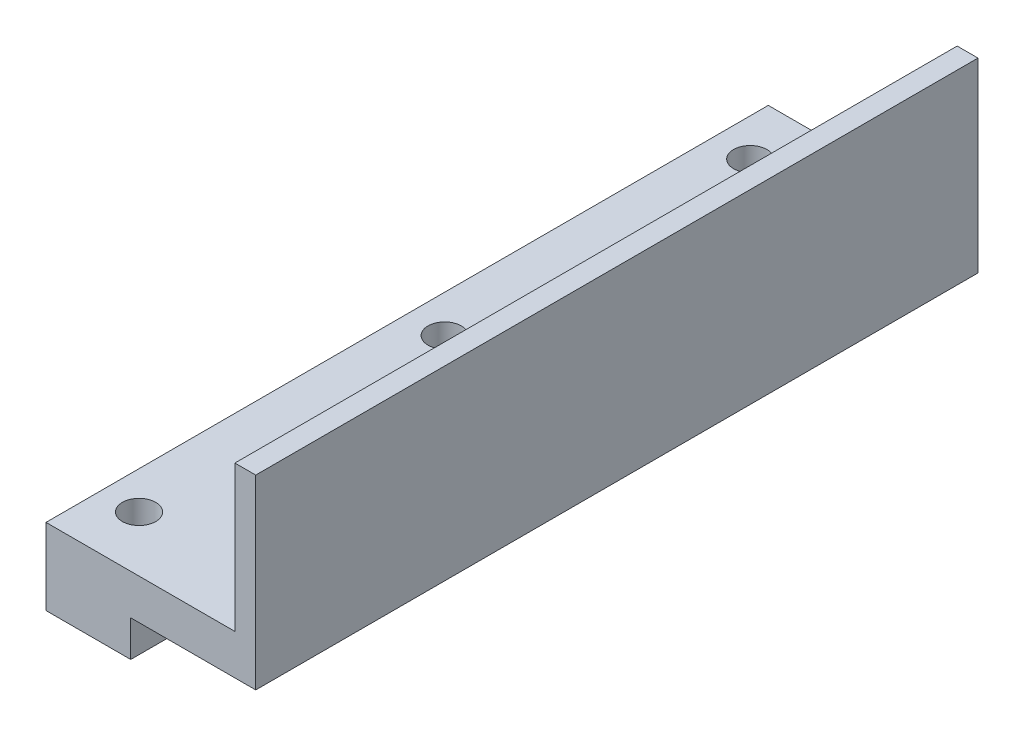
ISO-10303-21;
HEADER;
FILE_DESCRIPTION(('STEP AP214'),'2;1');
FILE_NAME('part.step','',(''),(''),'','','');
FILE_SCHEMA(('AUTOMOTIVE_DESIGN { 1 0 10303 214 1 1 1 1 }'));
ENDSEC;
DATA;
#1=APPLICATION_CONTEXT('core data for automotive mechanical design processes');
#2=APPLICATION_PROTOCOL_DEFINITION('international standard','automotive_design',2000,#1);
#3=PRODUCT_CONTEXT('',#1,'mechanical');
#4=PRODUCT('Part','Part','',(#3));
#5=PRODUCT_RELATED_PRODUCT_CATEGORY('part','',(#4));
#6=PRODUCT_DEFINITION_FORMATION('','',#4);
#7=PRODUCT_DEFINITION_CONTEXT('part definition',#1,'design');
#8=PRODUCT_DEFINITION('design','',#6,#7);
#9=PRODUCT_DEFINITION_SHAPE('','',#8);
#10=(LENGTH_UNIT() NAMED_UNIT(*) SI_UNIT(.MILLI.,.METRE.));
#11=(NAMED_UNIT(*) PLANE_ANGLE_UNIT() SI_UNIT($,.RADIAN.));
#12=(NAMED_UNIT(*) SI_UNIT($,.STERADIAN.) SOLID_ANGLE_UNIT());
#13=UNCERTAINTY_MEASURE_WITH_UNIT(LENGTH_MEASURE(1.E-05),#10,'distance_accuracy_value','');
#14=(GEOMETRIC_REPRESENTATION_CONTEXT(3) GLOBAL_UNCERTAINTY_ASSIGNED_CONTEXT((#13)) GLOBAL_UNIT_ASSIGNED_CONTEXT((#10,
#11,#12)) REPRESENTATION_CONTEXT('',''));
#15=CARTESIAN_POINT('',(0.,0.,0.));
#16=DIRECTION('',(0.,0.,1.));
#17=DIRECTION('',(1.,0.,0.));
#18=AXIS2_PLACEMENT_3D('',#15,#16,#17);
#19=CARTESIAN_POINT('',(13.6,5.5,26.));
#20=DIRECTION('',(0.,-1.,0.));
#21=DIRECTION('',(1.,0.,0.));
#22=AXIS2_PLACEMENT_3D('',#19,#20,#21);
#23=PLANE('',#22);
#24=CARTESIAN_POINT('',(2.7,5.5,-22.));
#25=DIRECTION('',(0.,1.,0.));
#26=DIRECTION('',(0.,0.,1.));
#27=AXIS2_PLACEMENT_3D('',#24,#25,#26);
#28=CIRCLE('',#27,1.2);
#29=CARTESIAN_POINT('',(2.7,5.5,-20.8));
#30=VERTEX_POINT('',#29);
#31=EDGE_CURVE('E143',#30,#30,#28,.T.);
#32=ORIENTED_EDGE('',*,*,#31,.F.);
#33=EDGE_LOOP('',(#32));
#34=FACE_BOUND('',#33,.T.);
#35=CARTESIAN_POINT('',(2.7,5.5,0.));
#36=DIRECTION('',(0.,1.,0.));
#37=DIRECTION('',(0.,0.,1.));
#38=AXIS2_PLACEMENT_3D('',#35,#36,#37);
#39=CIRCLE('',#38,1.2);
#40=CARTESIAN_POINT('',(2.7,5.5,1.2));
#41=VERTEX_POINT('',#40);
#42=EDGE_CURVE('E138',#41,#41,#39,.T.);
#43=ORIENTED_EDGE('',*,*,#42,.F.);
#44=EDGE_LOOP('',(#43));
#45=FACE_BOUND('',#44,.T.);
#46=CARTESIAN_POINT('',(2.7,5.5,22.));
#47=DIRECTION('',(0.,1.,0.));
#48=DIRECTION('',(0.,0.,-1.));
#49=AXIS2_PLACEMENT_3D('',#46,#47,#48);
#50=CIRCLE('',#49,1.2);
#51=CARTESIAN_POINT('',(2.7,5.5,23.2));
#52=VERTEX_POINT('',#51);
#53=EDGE_CURVE('E135',#52,#52,#50,.T.);
#54=ORIENTED_EDGE('',*,*,#53,.F.);
#55=EDGE_LOOP('',(#54));
#56=FACE_BOUND('',#55,.T.);
#57=DIRECTION('',(-1.,0.,0.));
#58=VECTOR('',#57,1.);
#59=CARTESIAN_POINT('',(13.6,5.5,-26.));
#60=LINE('',#59,#58);
#61=CARTESIAN_POINT('',(13.6,5.5,-26.));
#62=VERTEX_POINT('',#61);
#63=CARTESIAN_POINT('',(0.,5.5,-26.));
#64=VERTEX_POINT('',#63);
#65=EDGE_CURVE('E159',#62,#64,#60,.T.);
#66=ORIENTED_EDGE('',*,*,#65,.T.);
#67=DIRECTION('',(0.,0.,-1.));
#68=VECTOR('',#67,1.);
#69=CARTESIAN_POINT('',(0.,5.5,26.));
#70=LINE('',#69,#68);
#71=CARTESIAN_POINT('',(0.,5.5,26.));
#72=VERTEX_POINT('',#71);
#73=EDGE_CURVE('E42',#72,#64,#70,.T.);
#74=ORIENTED_EDGE('',*,*,#73,.F.);
#75=DIRECTION('',(-1.,0.,0.));
#76=VECTOR('',#75,1.);
#77=CARTESIAN_POINT('',(13.6,5.5,26.));
#78=LINE('',#77,#76);
#79=CARTESIAN_POINT('',(13.6,5.5,26.));
#80=VERTEX_POINT('',#79);
#81=EDGE_CURVE('E85',#80,#72,#78,.T.);
#82=ORIENTED_EDGE('',*,*,#81,.F.);
#83=DIRECTION('',(0.,0.,-1.));
#84=VECTOR('',#83,1.);
#85=CARTESIAN_POINT('',(13.6,5.5,26.));
#86=LINE('',#85,#84);
#87=EDGE_CURVE('E11',#80,#62,#86,.T.);
#88=ORIENTED_EDGE('',*,*,#87,.T.);
#89=EDGE_LOOP('',(#66,#74,#82,#88));
#90=FACE_BOUND('',#89,.T.);
#91=ADVANCED_FACE('F33',(#34,#45,#56,#90),#23,.F.);
#92=CARTESIAN_POINT('',(0.,0.,26.));
#93=DIRECTION('',(1.,0.,0.));
#94=DIRECTION('',(0.,0.,-1.));
#95=AXIS2_PLACEMENT_3D('',#92,#93,#94);
#96=PLANE('',#95);
#97=DIRECTION('',(0.,-1.,0.));
#98=VECTOR('',#97,1.);
#99=CARTESIAN_POINT('',(0.,0.,-26.));
#100=LINE('',#99,#98);
#101=CARTESIAN_POINT('',(0.,0.,-26.));
#102=VERTEX_POINT('',#101);
#103=EDGE_CURVE('E161',#64,#102,#100,.T.);
#104=ORIENTED_EDGE('',*,*,#103,.T.);
#105=DIRECTION('',(0.,0.,-1.));
#106=VECTOR('',#105,1.);
#107=CARTESIAN_POINT('',(0.,0.,26.));
#108=LINE('',#107,#106);
#109=CARTESIAN_POINT('',(0.,0.,26.));
#110=VERTEX_POINT('',#109);
#111=EDGE_CURVE('E169',#110,#102,#108,.T.);
#112=ORIENTED_EDGE('',*,*,#111,.F.);
#113=DIRECTION('',(0.,-1.,0.));
#114=VECTOR('',#113,1.);
#115=CARTESIAN_POINT('',(0.,0.,26.));
#116=LINE('',#115,#114);
#117=EDGE_CURVE('E150',#72,#110,#116,.T.);
#118=ORIENTED_EDGE('',*,*,#117,.F.);
#119=ORIENTED_EDGE('',*,*,#73,.T.);
#120=EDGE_LOOP('',(#104,#112,#118,#119));
#121=FACE_BOUND('',#120,.T.);
#122=ADVANCED_FACE('F197',(#121),#96,.F.);
#123=CARTESIAN_POINT('',(0.,0.,26.));
#124=DIRECTION('',(0.,1.,0.));
#125=DIRECTION('',(-1.,0.,0.));
#126=AXIS2_PLACEMENT_3D('',#123,#124,#125);
#127=PLANE('',#126);
#128=CARTESIAN_POINT('',(2.7,0.,-22.));
#129=DIRECTION('',(0.,1.,0.));
#130=DIRECTION('',(-1.,0.,0.));
#131=AXIS2_PLACEMENT_3D('',#128,#129,#130);
#132=CIRCLE('',#131,1.2);
#133=CARTESIAN_POINT('',(2.7,0.,-20.8));
#134=VERTEX_POINT('',#133);
#135=EDGE_CURVE('E36',#134,#134,#132,.T.);
#136=ORIENTED_EDGE('',*,*,#135,.T.);
#137=EDGE_LOOP('',(#136));
#138=FACE_BOUND('',#137,.T.);
#139=CARTESIAN_POINT('',(2.7,0.,0.));
#140=DIRECTION('',(0.,1.,0.));
#141=DIRECTION('',(-1.,0.,0.));
#142=AXIS2_PLACEMENT_3D('',#139,#140,#141);
#143=CIRCLE('',#142,1.2);
#144=CARTESIAN_POINT('',(2.7,0.,1.2));
#145=VERTEX_POINT('',#144);
#146=EDGE_CURVE('E174',#145,#145,#143,.T.);
#147=ORIENTED_EDGE('',*,*,#146,.T.);
#148=EDGE_LOOP('',(#147));
#149=FACE_BOUND('',#148,.T.);
#150=CARTESIAN_POINT('',(2.7,0.,22.));
#151=DIRECTION('',(0.,1.,0.));
#152=DIRECTION('',(-1.,0.,0.));
#153=AXIS2_PLACEMENT_3D('',#150,#151,#152);
#154=CIRCLE('',#153,1.2);
#155=CARTESIAN_POINT('',(2.7,0.,23.2));
#156=VERTEX_POINT('',#155);
#157=EDGE_CURVE('E146',#156,#156,#154,.T.);
#158=ORIENTED_EDGE('',*,*,#157,.T.);
#159=EDGE_LOOP('',(#158));
#160=FACE_BOUND('',#159,.T.);
#161=DIRECTION('',(1.,0.,0.));
#162=VECTOR('',#161,1.);
#163=CARTESIAN_POINT('',(0.,0.,-26.));
#164=LINE('',#163,#162);
#165=CARTESIAN_POINT('',(6.1,0.,-26.));
#166=VERTEX_POINT('',#165);
#167=EDGE_CURVE('E72',#102,#166,#164,.T.);
#168=ORIENTED_EDGE('',*,*,#167,.T.);
#169=DIRECTION('',(0.,0.,-1.));
#170=VECTOR('',#169,1.);
#171=CARTESIAN_POINT('',(6.1,0.,26.));
#172=LINE('',#171,#170);
#173=CARTESIAN_POINT('',(6.1,0.,26.));
#174=VERTEX_POINT('',#173);
#175=EDGE_CURVE('E167',#174,#166,#172,.T.);
#176=ORIENTED_EDGE('',*,*,#175,.F.);
#177=DIRECTION('',(1.,0.,0.));
#178=VECTOR('',#177,1.);
#179=CARTESIAN_POINT('',(0.,0.,26.));
#180=LINE('',#179,#178);
#181=EDGE_CURVE('E153',#110,#174,#180,.T.);
#182=ORIENTED_EDGE('',*,*,#181,.F.);
#183=ORIENTED_EDGE('',*,*,#111,.T.);
#184=EDGE_LOOP('',(#168,#176,#182,#183));
#185=FACE_BOUND('',#184,.T.);
#186=ADVANCED_FACE('F181',(#138,#149,#160,#185),#127,.F.);
#187=CARTESIAN_POINT('',(6.1,2.6,26.));
#188=DIRECTION('',(-1.,0.,0.));
#189=DIRECTION('',(0.,-1.,0.));
#190=AXIS2_PLACEMENT_3D('',#187,#188,#189);
#191=PLANE('',#190);
#192=DIRECTION('',(0.,1.,0.));
#193=VECTOR('',#192,1.);
#194=CARTESIAN_POINT('',(6.1,2.6,-26.));
#195=LINE('',#194,#193);
#196=CARTESIAN_POINT('',(6.1,2.6,-26.));
#197=VERTEX_POINT('',#196);
#198=EDGE_CURVE('E78',#166,#197,#195,.T.);
#199=ORIENTED_EDGE('',*,*,#198,.T.);
#200=DIRECTION('',(0.,0.,-1.));
#201=VECTOR('',#200,1.);
#202=CARTESIAN_POINT('',(6.1,2.6,26.));
#203=LINE('',#202,#201);
#204=CARTESIAN_POINT('',(6.1,2.6,26.));
#205=VERTEX_POINT('',#204);
#206=EDGE_CURVE('E158',#205,#197,#203,.T.);
#207=ORIENTED_EDGE('',*,*,#206,.F.);
#208=DIRECTION('',(0.,1.,0.));
#209=VECTOR('',#208,1.);
#210=CARTESIAN_POINT('',(6.1,2.6,26.));
#211=LINE('',#210,#209);
#212=EDGE_CURVE('E51',#174,#205,#211,.T.);
#213=ORIENTED_EDGE('',*,*,#212,.F.);
#214=ORIENTED_EDGE('',*,*,#175,.T.);
#215=EDGE_LOOP('',(#199,#207,#213,#214));
#216=FACE_BOUND('',#215,.T.);
#217=ADVANCED_FACE('F215',(#216),#191,.F.);
#218=CARTESIAN_POINT('',(6.1,2.6,26.));
#219=DIRECTION('',(0.,1.,0.));
#220=DIRECTION('',(-1.,0.,0.));
#221=AXIS2_PLACEMENT_3D('',#218,#219,#220);
#222=PLANE('',#221);
#223=DIRECTION('',(1.,0.,0.));
#224=VECTOR('',#223,1.);
#225=CARTESIAN_POINT('',(6.1,2.6,-26.));
#226=LINE('',#225,#224);
#227=CARTESIAN_POINT('',(15.1,2.60000000000001,-26.));
#228=VERTEX_POINT('',#227);
#229=EDGE_CURVE('E151',#197,#228,#226,.T.);
#230=ORIENTED_EDGE('',*,*,#229,.T.);
#231=DIRECTION('',(0.,0.,-1.));
#232=VECTOR('',#231,1.);
#233=CARTESIAN_POINT('',(15.1,2.60000000000001,-26.));
#234=LINE('',#233,#232);
#235=CARTESIAN_POINT('',(15.1,2.6,26.));
#236=VERTEX_POINT('',#235);
#237=EDGE_CURVE('E126',#236,#228,#234,.T.);
#238=ORIENTED_EDGE('',*,*,#237,.F.);
#239=DIRECTION('',(1.,0.,0.));
#240=VECTOR('',#239,1.);
#241=CARTESIAN_POINT('',(6.1,2.6,26.));
#242=LINE('',#241,#240);
#243=EDGE_CURVE('E156',#205,#236,#242,.T.);
#244=ORIENTED_EDGE('',*,*,#243,.F.);
#245=ORIENTED_EDGE('',*,*,#206,.T.);
#246=EDGE_LOOP('',(#230,#238,#244,#245));
#247=FACE_BOUND('',#246,.T.);
#248=ADVANCED_FACE('F213',(#247),#222,.F.);
#249=CARTESIAN_POINT('',(0.,0.,26.));
#250=DIRECTION('',(0.,0.,1.));
#251=DIRECTION('',(1.,0.,0.));
#252=AXIS2_PLACEMENT_3D('',#249,#250,#251);
#253=PLANE('',#252);
#254=ORIENTED_EDGE('',*,*,#243,.T.);
#255=DIRECTION('',(0.,-1.,0.));
#256=VECTOR('',#255,1.);
#257=CARTESIAN_POINT('',(15.1,2.6,26.));
#258=LINE('',#257,#256);
#259=CARTESIAN_POINT('',(15.1,16.,26.));
#260=VERTEX_POINT('',#259);
#261=EDGE_CURVE('E119',#260,#236,#258,.T.);
#262=ORIENTED_EDGE('',*,*,#261,.F.);
#263=DIRECTION('',(-1.,0.,0.));
#264=VECTOR('',#263,1.);
#265=CARTESIAN_POINT('',(15.1,16.,26.));
#266=LINE('',#265,#264);
#267=CARTESIAN_POINT('',(13.6,16.,26.));
#268=VERTEX_POINT('',#267);
#269=EDGE_CURVE('E115',#260,#268,#266,.T.);
#270=ORIENTED_EDGE('',*,*,#269,.T.);
#271=DIRECTION('',(0.,-1.,0.));
#272=VECTOR('',#271,1.);
#273=CARTESIAN_POINT('',(13.6,2.6,26.));
#274=LINE('',#273,#272);
#275=EDGE_CURVE('E129',#268,#80,#274,.T.);
#276=ORIENTED_EDGE('',*,*,#275,.T.);
#277=ORIENTED_EDGE('',*,*,#81,.T.);
#278=ORIENTED_EDGE('',*,*,#117,.T.);
#279=ORIENTED_EDGE('',*,*,#181,.T.);
#280=ORIENTED_EDGE('',*,*,#212,.T.);
#281=EDGE_LOOP('',(#254,#262,#270,#276,#277,#278,#279,#280));
#282=FACE_BOUND('',#281,.T.);
#283=ADVANCED_FACE('F217',(#282),#253,.T.);
#284=CARTESIAN_POINT('',(0.,0.,-26.));
#285=DIRECTION('',(0.,0.,1.));
#286=DIRECTION('',(1.,0.,0.));
#287=AXIS2_PLACEMENT_3D('',#284,#285,#286);
#288=PLANE('',#287);
#289=ORIENTED_EDGE('',*,*,#65,.F.);
#290=DIRECTION('',(0.,1.,0.));
#291=VECTOR('',#290,1.);
#292=CARTESIAN_POINT('',(13.6,2.60000000000001,-26.));
#293=LINE('',#292,#291);
#294=CARTESIAN_POINT('',(13.6,16.,-26.));
#295=VERTEX_POINT('',#294);
#296=EDGE_CURVE('E133',#62,#295,#293,.T.);
#297=ORIENTED_EDGE('',*,*,#296,.T.);
#298=DIRECTION('',(-1.,0.,0.));
#299=VECTOR('',#298,1.);
#300=CARTESIAN_POINT('',(15.1,16.,-26.));
#301=LINE('',#300,#299);
#302=CARTESIAN_POINT('',(15.1,16.,-26.));
#303=VERTEX_POINT('',#302);
#304=EDGE_CURVE('E113',#303,#295,#301,.T.);
#305=ORIENTED_EDGE('',*,*,#304,.F.);
#306=DIRECTION('',(0.,1.,0.));
#307=VECTOR('',#306,1.);
#308=CARTESIAN_POINT('',(15.1,2.60000000000001,-26.));
#309=LINE('',#308,#307);
#310=EDGE_CURVE('E120',#228,#303,#309,.T.);
#311=ORIENTED_EDGE('',*,*,#310,.F.);
#312=ORIENTED_EDGE('',*,*,#229,.F.);
#313=ORIENTED_EDGE('',*,*,#198,.F.);
#314=ORIENTED_EDGE('',*,*,#167,.F.);
#315=ORIENTED_EDGE('',*,*,#103,.F.);
#316=EDGE_LOOP('',(#289,#297,#305,#311,#312,#313,#314,#315));
#317=FACE_BOUND('',#316,.T.);
#318=ADVANCED_FACE('F132',(#317),#288,.F.);
#319=CARTESIAN_POINT('',(2.7,-1.2E-05,22.));
#320=DIRECTION('',(0.,1.,0.));
#321=DIRECTION('',(0.,0.,1.));
#322=AXIS2_PLACEMENT_3D('',#319,#320,#321);
#323=CYLINDRICAL_SURFACE('',#322,1.2);
#324=CARTESIAN_POINT('',(2.7,5.5,23.2));
#325=CARTESIAN_POINT('',(2.7,5.44270833333333,23.2));
#326=CARTESIAN_POINT('',(2.7,5.38541666666667,23.2));
#327=CARTESIAN_POINT('',(2.7,5.27083333333333,23.2));
#328=CARTESIAN_POINT('',(2.7,5.21354166666667,23.2));
#329=CARTESIAN_POINT('',(2.7,5.09895833333333,23.2));
#330=CARTESIAN_POINT('',(2.7,5.04166666666667,23.2));
#331=CARTESIAN_POINT('',(2.7,4.92708333333333,23.2));
#332=CARTESIAN_POINT('',(2.7,4.86979166666667,23.2));
#333=CARTESIAN_POINT('',(2.7,4.75520833333333,23.2));
#334=CARTESIAN_POINT('',(2.7,4.69791666666667,23.2));
#335=CARTESIAN_POINT('',(2.7,4.58333333333333,23.2));
#336=CARTESIAN_POINT('',(2.7,4.52604166666667,23.2));
#337=CARTESIAN_POINT('',(2.7,4.41145833333333,23.2));
#338=CARTESIAN_POINT('',(2.7,4.35416666666667,23.2));
#339=CARTESIAN_POINT('',(2.7,4.23958333333333,23.2));
#340=CARTESIAN_POINT('',(2.7,4.18229166666667,23.2));
#341=CARTESIAN_POINT('',(2.7,4.06770833333333,23.2));
#342=CARTESIAN_POINT('',(2.7,4.01041666666667,23.2));
#343=CARTESIAN_POINT('',(2.7,3.89583333333333,23.2));
#344=CARTESIAN_POINT('',(2.7,3.83854166666667,23.2));
#345=CARTESIAN_POINT('',(2.7,3.72395833333333,23.2));
#346=CARTESIAN_POINT('',(2.7,3.66666666666667,23.2));
#347=CARTESIAN_POINT('',(2.7,3.55208333333333,23.2));
#348=CARTESIAN_POINT('',(2.7,3.49479166666667,23.2));
#349=CARTESIAN_POINT('',(2.7,3.38020833333333,23.2));
#350=CARTESIAN_POINT('',(2.7,3.32291666666667,23.2));
#351=CARTESIAN_POINT('',(2.7,3.20833333333333,23.2));
#352=CARTESIAN_POINT('',(2.7,3.15104166666667,23.2));
#353=CARTESIAN_POINT('',(2.7,3.03645833333333,23.2));
#354=CARTESIAN_POINT('',(2.7,2.97916666666667,23.2));
#355=CARTESIAN_POINT('',(2.7,2.86458333333333,23.2));
#356=CARTESIAN_POINT('',(2.7,2.80729166666667,23.2));
#357=CARTESIAN_POINT('',(2.7,2.69270833333333,23.2));
#358=CARTESIAN_POINT('',(2.7,2.63541666666667,23.2));
#359=CARTESIAN_POINT('',(2.7,2.52083333333333,23.2));
#360=CARTESIAN_POINT('',(2.7,2.46354166666667,23.2));
#361=CARTESIAN_POINT('',(2.7,2.34895833333333,23.2));
#362=CARTESIAN_POINT('',(2.7,2.29166666666667,23.2));
#363=CARTESIAN_POINT('',(2.7,2.17708333333333,23.2));
#364=CARTESIAN_POINT('',(2.7,2.11979166666667,23.2));
#365=CARTESIAN_POINT('',(2.7,2.00520833333333,23.2));
#366=CARTESIAN_POINT('',(2.7,1.94791666666667,23.2));
#367=CARTESIAN_POINT('',(2.7,1.83333333333333,23.2));
#368=CARTESIAN_POINT('',(2.7,1.77604166666667,23.2));
#369=CARTESIAN_POINT('',(2.7,1.66145833333333,23.2));
#370=CARTESIAN_POINT('',(2.7,1.60416666666667,23.2));
#371=CARTESIAN_POINT('',(2.7,1.48958333333333,23.2));
#372=CARTESIAN_POINT('',(2.7,1.43229166666667,23.2));
#373=CARTESIAN_POINT('',(2.7,1.31770833333333,23.2));
#374=CARTESIAN_POINT('',(2.7,1.26041666666667,23.2));
#375=CARTESIAN_POINT('',(2.7,1.14583333333333,23.2));
#376=CARTESIAN_POINT('',(2.7,1.08854166666667,23.2));
#377=CARTESIAN_POINT('',(2.7,0.973958333333334,23.2));
#378=CARTESIAN_POINT('',(2.7,0.916666666666667,23.2));
#379=CARTESIAN_POINT('',(2.7,0.802083333333334,23.2));
#380=CARTESIAN_POINT('',(2.7,0.744791666666667,23.2));
#381=CARTESIAN_POINT('',(2.7,0.630208333333333,23.2));
#382=CARTESIAN_POINT('',(2.7,0.572916666666667,23.2));
#383=CARTESIAN_POINT('',(2.7,0.458333333333334,23.2));
#384=CARTESIAN_POINT('',(2.7,0.401041666666667,23.2));
#385=CARTESIAN_POINT('',(2.7,0.286458333333334,23.2));
#386=CARTESIAN_POINT('',(2.7,0.229166666666667,23.2));
#387=CARTESIAN_POINT('',(2.7,0.114583333333334,23.2));
#388=CARTESIAN_POINT('',(2.7,0.0572916666666675,23.2));
#389=CARTESIAN_POINT('',(2.7,0.,23.2));
#390=B_SPLINE_CURVE_WITH_KNOTS('',3,(#324,#325,#326,#327,#328,#329,#330,#331,#332,#333,#334,
#335,#336,#337,#338,#339,#340,#341,#342,#343,#344,#345,#346,#347,#348,#349,#350,#351,#352,#353,
#354,#355,#356,#357,#358,#359,#360,#361,#362,#363,#364,#365,#366,#367,#368,#369,#370,#371,#372,
#373,#374,#375,#376,#377,#378,#379,#380,#381,#382,#383,#384,#385,#386,#387,#388,#389),
.UNSPECIFIED.,.F.,.F.,(4,2,2,2,2,2,2,2,2,2,2,2,2,2,2,2,2,2,2,2,2,2,2,2,2,2,2,2,2,2,2,2,4),(0.,
0.171875,0.34375,0.515625,0.6875,0.859375,1.03125,1.203125,1.375,1.546875,1.71875,1.890625,
2.0625,2.234375,2.40625,2.578125,2.75,2.921875,3.09375,3.265625,3.4375,3.609375,3.78125,
3.953125,4.125,4.296875,4.46875,4.640625,4.8125,4.984375,5.15625,5.328125,5.5),.UNSPECIFIED.);
#391=EDGE_CURVE('BSEAM193',#52,#156,#390,.T.);
#392=ORIENTED_EDGE('',*,*,#53,.T.);
#393=ORIENTED_EDGE('',*,*,#157,.F.);
#394=ORIENTED_EDGE('',*,*,#391,.T.);
#395=ORIENTED_EDGE('',*,*,#391,.F.);
#396=EDGE_LOOP('',(#392,#394,#393,#395));
#397=FACE_BOUND('',#396,.T.);
#398=ADVANCED_FACE('F193',(#397),#323,.F.);
#399=CARTESIAN_POINT('',(2.7,-1.2E-05,0.));
#400=DIRECTION('',(0.,1.,0.));
#401=DIRECTION('',(0.,0.,1.));
#402=AXIS2_PLACEMENT_3D('',#399,#400,#401);
#403=CYLINDRICAL_SURFACE('',#402,1.2);
#404=CARTESIAN_POINT('',(2.7,5.5,1.2));
#405=CARTESIAN_POINT('',(2.7,5.44270833333333,1.2));
#406=CARTESIAN_POINT('',(2.7,5.38541666666667,1.2));
#407=CARTESIAN_POINT('',(2.7,5.27083333333333,1.2));
#408=CARTESIAN_POINT('',(2.7,5.21354166666667,1.2));
#409=CARTESIAN_POINT('',(2.7,5.09895833333333,1.2));
#410=CARTESIAN_POINT('',(2.7,5.04166666666667,1.2));
#411=CARTESIAN_POINT('',(2.7,4.92708333333333,1.2));
#412=CARTESIAN_POINT('',(2.7,4.86979166666667,1.2));
#413=CARTESIAN_POINT('',(2.7,4.75520833333333,1.2));
#414=CARTESIAN_POINT('',(2.7,4.69791666666667,1.2));
#415=CARTESIAN_POINT('',(2.7,4.58333333333333,1.2));
#416=CARTESIAN_POINT('',(2.7,4.52604166666667,1.2));
#417=CARTESIAN_POINT('',(2.7,4.41145833333333,1.2));
#418=CARTESIAN_POINT('',(2.7,4.35416666666667,1.2));
#419=CARTESIAN_POINT('',(2.7,4.23958333333333,1.2));
#420=CARTESIAN_POINT('',(2.7,4.18229166666667,1.2));
#421=CARTESIAN_POINT('',(2.7,4.06770833333333,1.2));
#422=CARTESIAN_POINT('',(2.7,4.01041666666667,1.2));
#423=CARTESIAN_POINT('',(2.7,3.89583333333333,1.2));
#424=CARTESIAN_POINT('',(2.7,3.83854166666667,1.2));
#425=CARTESIAN_POINT('',(2.7,3.72395833333333,1.2));
#426=CARTESIAN_POINT('',(2.7,3.66666666666667,1.2));
#427=CARTESIAN_POINT('',(2.7,3.55208333333333,1.2));
#428=CARTESIAN_POINT('',(2.7,3.49479166666667,1.2));
#429=CARTESIAN_POINT('',(2.7,3.38020833333333,1.2));
#430=CARTESIAN_POINT('',(2.7,3.32291666666667,1.2));
#431=CARTESIAN_POINT('',(2.7,3.20833333333333,1.2));
#432=CARTESIAN_POINT('',(2.7,3.15104166666667,1.2));
#433=CARTESIAN_POINT('',(2.7,3.03645833333333,1.2));
#434=CARTESIAN_POINT('',(2.7,2.97916666666667,1.2));
#435=CARTESIAN_POINT('',(2.7,2.86458333333333,1.2));
#436=CARTESIAN_POINT('',(2.7,2.80729166666667,1.2));
#437=CARTESIAN_POINT('',(2.7,2.69270833333333,1.2));
#438=CARTESIAN_POINT('',(2.7,2.63541666666667,1.2));
#439=CARTESIAN_POINT('',(2.7,2.52083333333333,1.2));
#440=CARTESIAN_POINT('',(2.7,2.46354166666667,1.2));
#441=CARTESIAN_POINT('',(2.7,2.34895833333333,1.2));
#442=CARTESIAN_POINT('',(2.7,2.29166666666667,1.2));
#443=CARTESIAN_POINT('',(2.7,2.17708333333333,1.2));
#444=CARTESIAN_POINT('',(2.7,2.11979166666667,1.2));
#445=CARTESIAN_POINT('',(2.7,2.00520833333333,1.2));
#446=CARTESIAN_POINT('',(2.7,1.94791666666667,1.2));
#447=CARTESIAN_POINT('',(2.7,1.83333333333333,1.2));
#448=CARTESIAN_POINT('',(2.7,1.77604166666667,1.2));
#449=CARTESIAN_POINT('',(2.7,1.66145833333333,1.2));
#450=CARTESIAN_POINT('',(2.7,1.60416666666667,1.2));
#451=CARTESIAN_POINT('',(2.7,1.48958333333333,1.2));
#452=CARTESIAN_POINT('',(2.7,1.43229166666667,1.2));
#453=CARTESIAN_POINT('',(2.7,1.31770833333333,1.2));
#454=CARTESIAN_POINT('',(2.7,1.26041666666667,1.2));
#455=CARTESIAN_POINT('',(2.7,1.14583333333333,1.2));
#456=CARTESIAN_POINT('',(2.7,1.08854166666667,1.2));
#457=CARTESIAN_POINT('',(2.7,0.973958333333334,1.2));
#458=CARTESIAN_POINT('',(2.7,0.916666666666667,1.2));
#459=CARTESIAN_POINT('',(2.7,0.802083333333334,1.2));
#460=CARTESIAN_POINT('',(2.7,0.744791666666667,1.2));
#461=CARTESIAN_POINT('',(2.7,0.630208333333333,1.2));
#462=CARTESIAN_POINT('',(2.7,0.572916666666667,1.2));
#463=CARTESIAN_POINT('',(2.7,0.458333333333334,1.2));
#464=CARTESIAN_POINT('',(2.7,0.401041666666667,1.2));
#465=CARTESIAN_POINT('',(2.7,0.286458333333334,1.2));
#466=CARTESIAN_POINT('',(2.7,0.229166666666667,1.2));
#467=CARTESIAN_POINT('',(2.7,0.114583333333334,1.2));
#468=CARTESIAN_POINT('',(2.7,0.0572916666666675,1.2));
#469=CARTESIAN_POINT('',(2.7,0.,1.2));
#470=B_SPLINE_CURVE_WITH_KNOTS('',3,(#404,#405,#406,#407,#408,#409,#410,#411,#412,#413,#414,
#415,#416,#417,#418,#419,#420,#421,#422,#423,#424,#425,#426,#427,#428,#429,#430,#431,#432,#433,
#434,#435,#436,#437,#438,#439,#440,#441,#442,#443,#444,#445,#446,#447,#448,#449,#450,#451,#452,
#453,#454,#455,#456,#457,#458,#459,#460,#461,#462,#463,#464,#465,#466,#467,#468,#469),
.UNSPECIFIED.,.F.,.F.,(4,2,2,2,2,2,2,2,2,2,2,2,2,2,2,2,2,2,2,2,2,2,2,2,2,2,2,2,2,2,2,2,4),(0.,
0.171875,0.34375,0.515625,0.6875,0.859375,1.03125,1.203125,1.375,1.546875,1.71875,1.890625,
2.0625,2.234375,2.40625,2.578125,2.75,2.921875,3.09375,3.265625,3.4375,3.609375,3.78125,
3.953125,4.125,4.296875,4.46875,4.640625,4.8125,4.984375,5.15625,5.328125,5.5),.UNSPECIFIED.);
#471=EDGE_CURVE('BSEAM185',#41,#145,#470,.T.);
#472=ORIENTED_EDGE('',*,*,#42,.T.);
#473=ORIENTED_EDGE('',*,*,#146,.F.);
#474=ORIENTED_EDGE('',*,*,#471,.T.);
#475=ORIENTED_EDGE('',*,*,#471,.F.);
#476=EDGE_LOOP('',(#472,#474,#473,#475));
#477=FACE_BOUND('',#476,.T.);
#478=ADVANCED_FACE('F185',(#477),#403,.F.);
#479=CARTESIAN_POINT('',(2.7,-1.2E-05,-22.));
#480=DIRECTION('',(0.,1.,0.));
#481=DIRECTION('',(0.,0.,1.));
#482=AXIS2_PLACEMENT_3D('',#479,#480,#481);
#483=CYLINDRICAL_SURFACE('',#482,1.2);
#484=CARTESIAN_POINT('',(2.7,5.5,-20.8));
#485=CARTESIAN_POINT('',(2.7,5.44270833333333,-20.8));
#486=CARTESIAN_POINT('',(2.7,5.38541666666667,-20.8));
#487=CARTESIAN_POINT('',(2.7,5.27083333333333,-20.8));
#488=CARTESIAN_POINT('',(2.7,5.21354166666667,-20.8));
#489=CARTESIAN_POINT('',(2.7,5.09895833333333,-20.8));
#490=CARTESIAN_POINT('',(2.7,5.04166666666667,-20.8));
#491=CARTESIAN_POINT('',(2.7,4.92708333333333,-20.8));
#492=CARTESIAN_POINT('',(2.7,4.86979166666667,-20.8));
#493=CARTESIAN_POINT('',(2.7,4.75520833333333,-20.8));
#494=CARTESIAN_POINT('',(2.7,4.69791666666667,-20.8));
#495=CARTESIAN_POINT('',(2.7,4.58333333333333,-20.8));
#496=CARTESIAN_POINT('',(2.7,4.52604166666667,-20.8));
#497=CARTESIAN_POINT('',(2.7,4.41145833333333,-20.8));
#498=CARTESIAN_POINT('',(2.7,4.35416666666667,-20.8));
#499=CARTESIAN_POINT('',(2.7,4.23958333333333,-20.8));
#500=CARTESIAN_POINT('',(2.7,4.18229166666667,-20.8));
#501=CARTESIAN_POINT('',(2.7,4.06770833333333,-20.8));
#502=CARTESIAN_POINT('',(2.7,4.01041666666667,-20.8));
#503=CARTESIAN_POINT('',(2.7,3.89583333333333,-20.8));
#504=CARTESIAN_POINT('',(2.7,3.83854166666667,-20.8));
#505=CARTESIAN_POINT('',(2.7,3.72395833333333,-20.8));
#506=CARTESIAN_POINT('',(2.7,3.66666666666667,-20.8));
#507=CARTESIAN_POINT('',(2.7,3.55208333333333,-20.8));
#508=CARTESIAN_POINT('',(2.7,3.49479166666667,-20.8));
#509=CARTESIAN_POINT('',(2.7,3.38020833333333,-20.8));
#510=CARTESIAN_POINT('',(2.7,3.32291666666667,-20.8));
#511=CARTESIAN_POINT('',(2.7,3.20833333333333,-20.8));
#512=CARTESIAN_POINT('',(2.7,3.15104166666667,-20.8));
#513=CARTESIAN_POINT('',(2.7,3.03645833333333,-20.8));
#514=CARTESIAN_POINT('',(2.7,2.97916666666667,-20.8));
#515=CARTESIAN_POINT('',(2.7,2.86458333333333,-20.8));
#516=CARTESIAN_POINT('',(2.7,2.80729166666667,-20.8));
#517=CARTESIAN_POINT('',(2.7,2.69270833333333,-20.8));
#518=CARTESIAN_POINT('',(2.7,2.63541666666667,-20.8));
#519=CARTESIAN_POINT('',(2.7,2.52083333333333,-20.8));
#520=CARTESIAN_POINT('',(2.7,2.46354166666667,-20.8));
#521=CARTESIAN_POINT('',(2.7,2.34895833333333,-20.8));
#522=CARTESIAN_POINT('',(2.7,2.29166666666667,-20.8));
#523=CARTESIAN_POINT('',(2.7,2.17708333333333,-20.8));
#524=CARTESIAN_POINT('',(2.7,2.11979166666667,-20.8));
#525=CARTESIAN_POINT('',(2.7,2.00520833333333,-20.8));
#526=CARTESIAN_POINT('',(2.7,1.94791666666667,-20.8));
#527=CARTESIAN_POINT('',(2.7,1.83333333333333,-20.8));
#528=CARTESIAN_POINT('',(2.7,1.77604166666667,-20.8));
#529=CARTESIAN_POINT('',(2.7,1.66145833333333,-20.8));
#530=CARTESIAN_POINT('',(2.7,1.60416666666667,-20.8));
#531=CARTESIAN_POINT('',(2.7,1.48958333333333,-20.8));
#532=CARTESIAN_POINT('',(2.7,1.43229166666667,-20.8));
#533=CARTESIAN_POINT('',(2.7,1.31770833333333,-20.8));
#534=CARTESIAN_POINT('',(2.7,1.26041666666667,-20.8));
#535=CARTESIAN_POINT('',(2.7,1.14583333333333,-20.8));
#536=CARTESIAN_POINT('',(2.7,1.08854166666667,-20.8));
#537=CARTESIAN_POINT('',(2.7,0.973958333333334,-20.8));
#538=CARTESIAN_POINT('',(2.7,0.916666666666667,-20.8));
#539=CARTESIAN_POINT('',(2.7,0.802083333333334,-20.8));
#540=CARTESIAN_POINT('',(2.7,0.744791666666667,-20.8));
#541=CARTESIAN_POINT('',(2.7,0.630208333333333,-20.8));
#542=CARTESIAN_POINT('',(2.7,0.572916666666667,-20.8));
#543=CARTESIAN_POINT('',(2.7,0.458333333333334,-20.8));
#544=CARTESIAN_POINT('',(2.7,0.401041666666667,-20.8));
#545=CARTESIAN_POINT('',(2.7,0.286458333333334,-20.8));
#546=CARTESIAN_POINT('',(2.7,0.229166666666667,-20.8));
#547=CARTESIAN_POINT('',(2.7,0.114583333333334,-20.8));
#548=CARTESIAN_POINT('',(2.7,0.0572916666666675,-20.8));
#549=CARTESIAN_POINT('',(2.7,0.,-20.8));
#550=B_SPLINE_CURVE_WITH_KNOTS('',3,(#484,#485,#486,#487,#488,#489,#490,#491,#492,#493,#494,
#495,#496,#497,#498,#499,#500,#501,#502,#503,#504,#505,#506,#507,#508,#509,#510,#511,#512,#513,
#514,#515,#516,#517,#518,#519,#520,#521,#522,#523,#524,#525,#526,#527,#528,#529,#530,#531,#532,
#533,#534,#535,#536,#537,#538,#539,#540,#541,#542,#543,#544,#545,#546,#547,#548,#549),
.UNSPECIFIED.,.F.,.F.,(4,2,2,2,2,2,2,2,2,2,2,2,2,2,2,2,2,2,2,2,2,2,2,2,2,2,2,2,2,2,2,2,4),(0.,
0.171875,0.34375,0.515625,0.6875,0.859375,1.03125,1.203125,1.375,1.546875,1.71875,1.890625,
2.0625,2.234375,2.40625,2.578125,2.75,2.921875,3.09375,3.265625,3.4375,3.609375,3.78125,
3.953125,4.125,4.296875,4.46875,4.640625,4.8125,4.984375,5.15625,5.328125,5.5),.UNSPECIFIED.);
#551=EDGE_CURVE('BSEAM183',#30,#134,#550,.T.);
#552=ORIENTED_EDGE('',*,*,#31,.T.);
#553=ORIENTED_EDGE('',*,*,#135,.F.);
#554=ORIENTED_EDGE('',*,*,#551,.T.);
#555=ORIENTED_EDGE('',*,*,#551,.F.);
#556=EDGE_LOOP('',(#552,#554,#553,#555));
#557=FACE_BOUND('',#556,.T.);
#558=ADVANCED_FACE('F183',(#557),#483,.F.);
#559=CARTESIAN_POINT('',(15.1,16.,-26.));
#560=DIRECTION('',(0.,-1.,0.));
#561=DIRECTION('',(0.,0.,-1.));
#562=AXIS2_PLACEMENT_3D('',#559,#560,#561);
#563=PLANE('',#562);
#564=DIRECTION('',(0.,0.,1.));
#565=VECTOR('',#564,1.);
#566=CARTESIAN_POINT('',(13.6,16.,-26.));
#567=LINE('',#566,#565);
#568=EDGE_CURVE('E290',#295,#268,#567,.T.);
#569=ORIENTED_EDGE('',*,*,#568,.T.);
#570=ORIENTED_EDGE('',*,*,#269,.F.);
#571=DIRECTION('',(0.,0.,1.));
#572=VECTOR('',#571,1.);
#573=CARTESIAN_POINT('',(15.1,16.,-26.));
#574=LINE('',#573,#572);
#575=EDGE_CURVE('E109',#303,#260,#574,.T.);
#576=ORIENTED_EDGE('',*,*,#575,.F.);
#577=ORIENTED_EDGE('',*,*,#304,.T.);
#578=EDGE_LOOP('',(#569,#570,#576,#577));
#579=FACE_BOUND('',#578,.T.);
#580=ADVANCED_FACE('F111',(#579),#563,.F.);
#581=CARTESIAN_POINT('',(15.1,0.,0.));
#582=DIRECTION('',(1.,0.,0.));
#583=DIRECTION('',(0.,0.,-1.));
#584=AXIS2_PLACEMENT_3D('',#581,#582,#583);
#585=PLANE('',#584);
#586=ORIENTED_EDGE('',*,*,#310,.T.);
#587=ORIENTED_EDGE('',*,*,#575,.T.);
#588=ORIENTED_EDGE('',*,*,#261,.T.);
#589=ORIENTED_EDGE('',*,*,#237,.T.);
#590=EDGE_LOOP('',(#586,#587,#588,#589));
#591=FACE_BOUND('',#590,.T.);
#592=ADVANCED_FACE('F124',(#591),#585,.T.);
#593=CARTESIAN_POINT('',(13.6,0.,0.));
#594=DIRECTION('',(1.,0.,0.));
#595=DIRECTION('',(0.,0.,-1.));
#596=AXIS2_PLACEMENT_3D('',#593,#594,#595);
#597=PLANE('',#596);
#598=ORIENTED_EDGE('',*,*,#87,.F.);
#599=ORIENTED_EDGE('',*,*,#275,.F.);
#600=ORIENTED_EDGE('',*,*,#568,.F.);
#601=ORIENTED_EDGE('',*,*,#296,.F.);
#602=EDGE_LOOP('',(#598,#599,#600,#601));
#603=FACE_BOUND('',#602,.T.);
#604=ADVANCED_FACE('F276',(#603),#597,.F.);
#605=CLOSED_SHELL('',(#91,#122,#186,#217,#248,#283,#318,#398,#478,#558,#580,#592,#604));
#606=MANIFOLD_SOLID_BREP('B2',#605);
#607=ADVANCED_BREP_SHAPE_REPRESENTATION('',(#18,#606),#14);
#608=SHAPE_DEFINITION_REPRESENTATION(#9,#607);
ENDSEC;
END-ISO-10303-21;
